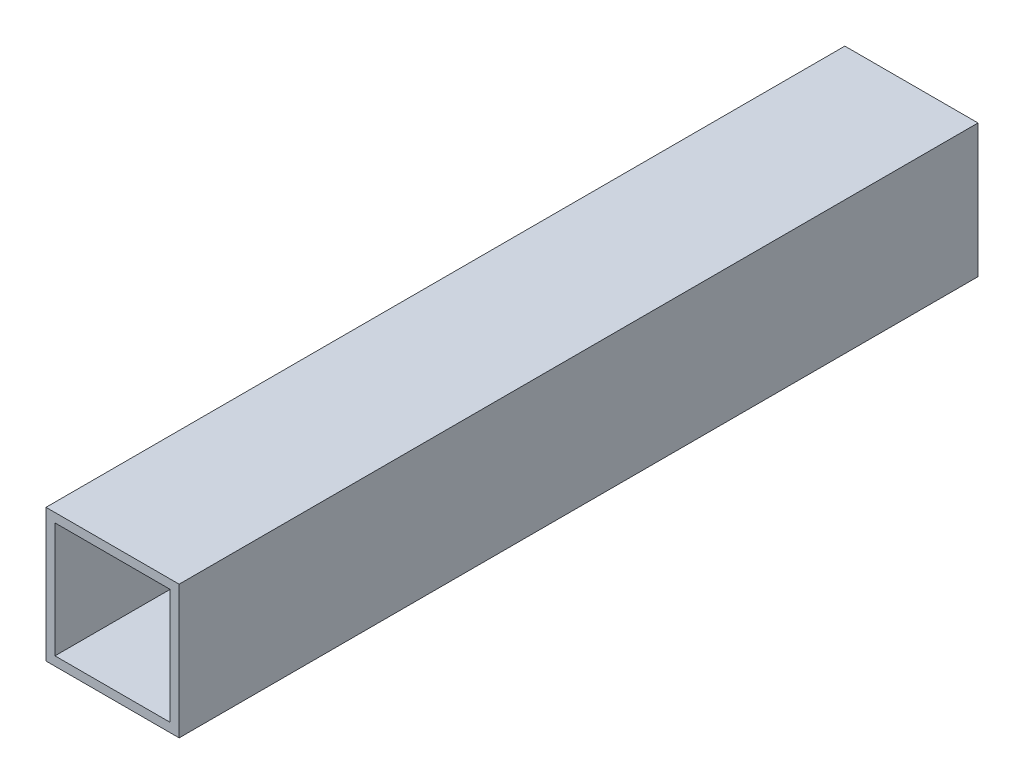
ISO-10303-21;
HEADER;
FILE_DESCRIPTION(('STEP AP214'),'2;1');
FILE_NAME('part.step','',(''),(''),'','','');
FILE_SCHEMA(('AUTOMOTIVE_DESIGN { 1 0 10303 214 1 1 1 1 }'));
ENDSEC;
DATA;
#1=APPLICATION_CONTEXT('core data for automotive mechanical design processes');
#2=APPLICATION_PROTOCOL_DEFINITION('international standard','automotive_design',2000,#1);
#3=PRODUCT_CONTEXT('',#1,'mechanical');
#4=PRODUCT('Part','Part','',(#3));
#5=PRODUCT_RELATED_PRODUCT_CATEGORY('part','',(#4));
#6=PRODUCT_DEFINITION_FORMATION('','',#4);
#7=PRODUCT_DEFINITION_CONTEXT('part definition',#1,'design');
#8=PRODUCT_DEFINITION('design','',#6,#7);
#9=PRODUCT_DEFINITION_SHAPE('','',#8);
#10=(LENGTH_UNIT() NAMED_UNIT(*) SI_UNIT(.MILLI.,.METRE.));
#11=(NAMED_UNIT(*) PLANE_ANGLE_UNIT() SI_UNIT($,.RADIAN.));
#12=(NAMED_UNIT(*) SI_UNIT($,.STERADIAN.) SOLID_ANGLE_UNIT());
#13=UNCERTAINTY_MEASURE_WITH_UNIT(LENGTH_MEASURE(1.E-05),#10,'distance_accuracy_value','');
#14=(GEOMETRIC_REPRESENTATION_CONTEXT(3) GLOBAL_UNCERTAINTY_ASSIGNED_CONTEXT((#13)) GLOBAL_UNIT_ASSIGNED_CONTEXT((#10,
#11,#12)) REPRESENTATION_CONTEXT('',''));
#15=CARTESIAN_POINT('',(0.,0.,0.));
#16=DIRECTION('',(0.,0.,1.));
#17=DIRECTION('',(1.,0.,0.));
#18=AXIS2_PLACEMENT_3D('',#15,#16,#17);
#19=CARTESIAN_POINT('',(0.,0.,76.2));
#20=DIRECTION('',(0.,0.,-1.));
#21=DIRECTION('',(-1.,0.,0.));
#22=AXIS2_PLACEMENT_3D('',#19,#20,#21);
#23=PLANE('',#22);
#24=DIRECTION('',(0.,1.,0.));
#25=VECTOR('',#24,1.);
#26=CARTESIAN_POINT('',(12.7,-12.7,76.2));
#27=LINE('',#26,#25);
#28=CARTESIAN_POINT('',(12.7,-12.7,76.2));
#29=VERTEX_POINT('',#28);
#30=CARTESIAN_POINT('',(12.7,12.7,76.2));
#31=VERTEX_POINT('',#30);
#32=EDGE_CURVE('E135',#29,#31,#27,.T.);
#33=ORIENTED_EDGE('',*,*,#32,.T.);
#34=DIRECTION('',(-1.,0.,0.));
#35=VECTOR('',#34,1.);
#36=CARTESIAN_POINT('',(-12.7,12.7,76.2));
#37=LINE('',#36,#35);
#38=CARTESIAN_POINT('',(-12.7,12.7,76.2));
#39=VERTEX_POINT('',#38);
#40=EDGE_CURVE('E138',#31,#39,#37,.T.);
#41=ORIENTED_EDGE('',*,*,#40,.T.);
#42=DIRECTION('',(0.,-1.,0.));
#43=VECTOR('',#42,1.);
#44=CARTESIAN_POINT('',(-12.7,-12.7,76.2));
#45=LINE('',#44,#43);
#46=CARTESIAN_POINT('',(-12.7,-12.7,76.2));
#47=VERTEX_POINT('',#46);
#48=EDGE_CURVE('E141',#39,#47,#45,.T.);
#49=ORIENTED_EDGE('',*,*,#48,.T.);
#50=DIRECTION('',(1.,0.,0.));
#51=VECTOR('',#50,1.);
#52=CARTESIAN_POINT('',(-12.7,-12.7,76.2));
#53=LINE('',#52,#51);
#54=EDGE_CURVE('E143',#47,#29,#53,.T.);
#55=ORIENTED_EDGE('',*,*,#54,.T.);
#56=EDGE_LOOP('',(#33,#41,#49,#55));
#57=FACE_BOUND('',#56,.T.);
#58=DIRECTION('',(0.,-1.,0.));
#59=VECTOR('',#58,1.);
#60=CARTESIAN_POINT('',(-10.9855,-10.9855,76.2));
#61=LINE('',#60,#59);
#62=CARTESIAN_POINT('',(-10.9855,10.9855,76.2));
#63=VERTEX_POINT('',#62);
#64=CARTESIAN_POINT('',(-10.9855,-10.9855,76.2));
#65=VERTEX_POINT('',#64);
#66=EDGE_CURVE('E99',#63,#65,#61,.T.);
#67=ORIENTED_EDGE('',*,*,#66,.F.);
#68=DIRECTION('',(-1.,0.,0.));
#69=VECTOR('',#68,1.);
#70=CARTESIAN_POINT('',(-10.9855,10.9855,76.2));
#71=LINE('',#70,#69);
#72=CARTESIAN_POINT('',(10.9855,10.9855,76.2));
#73=VERTEX_POINT('',#72);
#74=EDGE_CURVE('E121',#73,#63,#71,.T.);
#75=ORIENTED_EDGE('',*,*,#74,.F.);
#76=DIRECTION('',(0.,1.,0.));
#77=VECTOR('',#76,1.);
#78=CARTESIAN_POINT('',(10.9855,-10.9855,76.2));
#79=LINE('',#78,#77);
#80=CARTESIAN_POINT('',(10.9855,-10.9855,76.2));
#81=VERTEX_POINT('',#80);
#82=EDGE_CURVE('E119',#81,#73,#79,.T.);
#83=ORIENTED_EDGE('',*,*,#82,.F.);
#84=DIRECTION('',(1.,0.,0.));
#85=VECTOR('',#84,1.);
#86=CARTESIAN_POINT('',(-10.9855,-10.9855,76.2));
#87=LINE('',#86,#85);
#88=EDGE_CURVE('E107',#65,#81,#87,.T.);
#89=ORIENTED_EDGE('',*,*,#88,.F.);
#90=EDGE_LOOP('',(#67,#75,#83,#89));
#91=FACE_BOUND('',#90,.T.);
#92=ADVANCED_FACE('F34',(#57,#91),#23,.F.);
#93=CARTESIAN_POINT('',(0.,0.,-76.2));
#94=DIRECTION('',(0.,0.,-1.));
#95=DIRECTION('',(-1.,0.,0.));
#96=AXIS2_PLACEMENT_3D('',#93,#94,#95);
#97=PLANE('',#96);
#98=DIRECTION('',(0.,1.,0.));
#99=VECTOR('',#98,1.);
#100=CARTESIAN_POINT('',(12.7,-12.7,-76.2));
#101=LINE('',#100,#99);
#102=CARTESIAN_POINT('',(12.7,-12.7,-76.2));
#103=VERTEX_POINT('',#102);
#104=CARTESIAN_POINT('',(12.7,12.7,-76.2));
#105=VERTEX_POINT('',#104);
#106=EDGE_CURVE('E115',#103,#105,#101,.T.);
#107=ORIENTED_EDGE('',*,*,#106,.F.);
#108=DIRECTION('',(1.,0.,0.));
#109=VECTOR('',#108,1.);
#110=CARTESIAN_POINT('',(-12.7,-12.7,-76.2));
#111=LINE('',#110,#109);
#112=CARTESIAN_POINT('',(-12.7,-12.7,-76.2));
#113=VERTEX_POINT('',#112);
#114=EDGE_CURVE('E139',#113,#103,#111,.T.);
#115=ORIENTED_EDGE('',*,*,#114,.F.);
#116=DIRECTION('',(0.,-1.,0.));
#117=VECTOR('',#116,1.);
#118=CARTESIAN_POINT('',(-12.7,-12.7,-76.2));
#119=LINE('',#118,#117);
#120=CARTESIAN_POINT('',(-12.7,12.7,-76.2));
#121=VERTEX_POINT('',#120);
#122=EDGE_CURVE('E150',#121,#113,#119,.T.);
#123=ORIENTED_EDGE('',*,*,#122,.F.);
#124=DIRECTION('',(-1.,0.,0.));
#125=VECTOR('',#124,1.);
#126=CARTESIAN_POINT('',(-12.7,12.7,-76.2));
#127=LINE('',#126,#125);
#128=EDGE_CURVE('E148',#105,#121,#127,.T.);
#129=ORIENTED_EDGE('',*,*,#128,.F.);
#130=EDGE_LOOP('',(#107,#115,#123,#129));
#131=FACE_BOUND('',#130,.T.);
#132=DIRECTION('',(-1.,0.,0.));
#133=VECTOR('',#132,1.);
#134=CARTESIAN_POINT('',(-10.9855,10.9855,-76.2));
#135=LINE('',#134,#133);
#136=CARTESIAN_POINT('',(10.9855,10.9855,-76.2));
#137=VERTEX_POINT('',#136);
#138=CARTESIAN_POINT('',(-10.9855,10.9855,-76.2));
#139=VERTEX_POINT('',#138);
#140=EDGE_CURVE('E108',#137,#139,#135,.T.);
#141=ORIENTED_EDGE('',*,*,#140,.T.);
#142=DIRECTION('',(0.,-1.,0.));
#143=VECTOR('',#142,1.);
#144=CARTESIAN_POINT('',(-10.9855,-10.9855,-76.2));
#145=LINE('',#144,#143);
#146=CARTESIAN_POINT('',(-10.9855,-10.9855,-76.2));
#147=VERTEX_POINT('',#146);
#148=EDGE_CURVE('E57',#139,#147,#145,.T.);
#149=ORIENTED_EDGE('',*,*,#148,.T.);
#150=DIRECTION('',(1.,0.,0.));
#151=VECTOR('',#150,1.);
#152=CARTESIAN_POINT('',(-10.9855,-10.9855,-76.2));
#153=LINE('',#152,#151);
#154=CARTESIAN_POINT('',(10.9855,-10.9855,-76.2));
#155=VERTEX_POINT('',#154);
#156=EDGE_CURVE('E114',#147,#155,#153,.T.);
#157=ORIENTED_EDGE('',*,*,#156,.T.);
#158=DIRECTION('',(0.,1.,0.));
#159=VECTOR('',#158,1.);
#160=CARTESIAN_POINT('',(10.9855,-10.9855,-76.2));
#161=LINE('',#160,#159);
#162=EDGE_CURVE('E127',#155,#137,#161,.T.);
#163=ORIENTED_EDGE('',*,*,#162,.T.);
#164=EDGE_LOOP('',(#141,#149,#157,#163));
#165=FACE_BOUND('',#164,.T.);
#166=ADVANCED_FACE('F168',(#131,#165),#97,.T.);
#167=CARTESIAN_POINT('',(12.7,-12.7,76.2));
#168=DIRECTION('',(-1.,0.,0.));
#169=DIRECTION('',(0.,0.,1.));
#170=AXIS2_PLACEMENT_3D('',#167,#168,#169);
#171=PLANE('',#170);
#172=ORIENTED_EDGE('',*,*,#106,.T.);
#173=DIRECTION('',(0.,0.,-1.));
#174=VECTOR('',#173,1.);
#175=CARTESIAN_POINT('',(12.7,12.7,76.2));
#176=LINE('',#175,#174);
#177=EDGE_CURVE('E11',#31,#105,#176,.T.);
#178=ORIENTED_EDGE('',*,*,#177,.F.);
#179=ORIENTED_EDGE('',*,*,#32,.F.);
#180=DIRECTION('',(0.,0.,-1.));
#181=VECTOR('',#180,1.);
#182=CARTESIAN_POINT('',(12.7,-12.7,76.2));
#183=LINE('',#182,#181);
#184=EDGE_CURVE('E145',#29,#103,#183,.T.);
#185=ORIENTED_EDGE('',*,*,#184,.T.);
#186=EDGE_LOOP('',(#172,#178,#179,#185));
#187=FACE_BOUND('',#186,.T.);
#188=ADVANCED_FACE('F36',(#187),#171,.F.);
#189=CARTESIAN_POINT('',(-12.7,12.7,76.2));
#190=DIRECTION('',(0.,-1.,0.));
#191=DIRECTION('',(0.,0.,-1.));
#192=AXIS2_PLACEMENT_3D('',#189,#190,#191);
#193=PLANE('',#192);
#194=ORIENTED_EDGE('',*,*,#128,.T.);
#195=DIRECTION('',(0.,0.,-1.));
#196=VECTOR('',#195,1.);
#197=CARTESIAN_POINT('',(-12.7,12.7,76.2));
#198=LINE('',#197,#196);
#199=EDGE_CURVE('E42',#39,#121,#198,.T.);
#200=ORIENTED_EDGE('',*,*,#199,.F.);
#201=ORIENTED_EDGE('',*,*,#40,.F.);
#202=ORIENTED_EDGE('',*,*,#177,.T.);
#203=EDGE_LOOP('',(#194,#200,#201,#202));
#204=FACE_BOUND('',#203,.T.);
#205=ADVANCED_FACE('F178',(#204),#193,.F.);
#206=CARTESIAN_POINT('',(-12.7,-12.7,76.2));
#207=DIRECTION('',(1.,0.,0.));
#208=DIRECTION('',(0.,0.,-1.));
#209=AXIS2_PLACEMENT_3D('',#206,#207,#208);
#210=PLANE('',#209);
#211=ORIENTED_EDGE('',*,*,#122,.T.);
#212=DIRECTION('',(0.,0.,-1.));
#213=VECTOR('',#212,1.);
#214=CARTESIAN_POINT('',(-12.7,-12.7,76.2));
#215=LINE('',#214,#213);
#216=EDGE_CURVE('E155',#47,#113,#215,.T.);
#217=ORIENTED_EDGE('',*,*,#216,.F.);
#218=ORIENTED_EDGE('',*,*,#48,.F.);
#219=ORIENTED_EDGE('',*,*,#199,.T.);
#220=EDGE_LOOP('',(#211,#217,#218,#219));
#221=FACE_BOUND('',#220,.T.);
#222=ADVANCED_FACE('F162',(#221),#210,.F.);
#223=CARTESIAN_POINT('',(-12.7,-12.7,76.2));
#224=DIRECTION('',(0.,1.,0.));
#225=DIRECTION('',(0.,0.,1.));
#226=AXIS2_PLACEMENT_3D('',#223,#224,#225);
#227=PLANE('',#226);
#228=ORIENTED_EDGE('',*,*,#114,.T.);
#229=ORIENTED_EDGE('',*,*,#184,.F.);
#230=ORIENTED_EDGE('',*,*,#54,.F.);
#231=ORIENTED_EDGE('',*,*,#216,.T.);
#232=EDGE_LOOP('',(#228,#229,#230,#231));
#233=FACE_BOUND('',#232,.T.);
#234=ADVANCED_FACE('F172',(#233),#227,.F.);
#235=CARTESIAN_POINT('',(-10.9855,-10.9855,76.2));
#236=DIRECTION('',(1.,0.,0.));
#237=DIRECTION('',(0.,0.,-1.));
#238=AXIS2_PLACEMENT_3D('',#235,#236,#237);
#239=PLANE('',#238);
#240=ORIENTED_EDGE('',*,*,#148,.F.);
#241=DIRECTION('',(0.,0.,-1.));
#242=VECTOR('',#241,1.);
#243=CARTESIAN_POINT('',(-10.9855,10.9855,76.2));
#244=LINE('',#243,#242);
#245=EDGE_CURVE('E103',#63,#139,#244,.T.);
#246=ORIENTED_EDGE('',*,*,#245,.F.);
#247=ORIENTED_EDGE('',*,*,#66,.T.);
#248=DIRECTION('',(0.,0.,-1.));
#249=VECTOR('',#248,1.);
#250=CARTESIAN_POINT('',(-10.9855,-10.9855,76.2));
#251=LINE('',#250,#249);
#252=EDGE_CURVE('E102',#65,#147,#251,.T.);
#253=ORIENTED_EDGE('',*,*,#252,.T.);
#254=EDGE_LOOP('',(#240,#246,#247,#253));
#255=FACE_BOUND('',#254,.T.);
#256=ADVANCED_FACE('F101',(#255),#239,.T.);
#257=CARTESIAN_POINT('',(-10.9855,-10.9855,76.2));
#258=DIRECTION('',(0.,1.,0.));
#259=DIRECTION('',(0.,0.,1.));
#260=AXIS2_PLACEMENT_3D('',#257,#258,#259);
#261=PLANE('',#260);
#262=ORIENTED_EDGE('',*,*,#156,.F.);
#263=ORIENTED_EDGE('',*,*,#252,.F.);
#264=ORIENTED_EDGE('',*,*,#88,.T.);
#265=DIRECTION('',(0.,0.,-1.));
#266=VECTOR('',#265,1.);
#267=CARTESIAN_POINT('',(10.9855,-10.9855,76.2));
#268=LINE('',#267,#266);
#269=EDGE_CURVE('E116',#81,#155,#268,.T.);
#270=ORIENTED_EDGE('',*,*,#269,.T.);
#271=EDGE_LOOP('',(#262,#263,#264,#270));
#272=FACE_BOUND('',#271,.T.);
#273=ADVANCED_FACE('F111',(#272),#261,.T.);
#274=CARTESIAN_POINT('',(10.9855,-10.9855,76.2));
#275=DIRECTION('',(-1.,0.,0.));
#276=DIRECTION('',(0.,0.,1.));
#277=AXIS2_PLACEMENT_3D('',#274,#275,#276);
#278=PLANE('',#277);
#279=ORIENTED_EDGE('',*,*,#162,.F.);
#280=ORIENTED_EDGE('',*,*,#269,.F.);
#281=ORIENTED_EDGE('',*,*,#82,.T.);
#282=DIRECTION('',(0.,0.,-1.));
#283=VECTOR('',#282,1.);
#284=CARTESIAN_POINT('',(10.9855,10.9855,76.2));
#285=LINE('',#284,#283);
#286=EDGE_CURVE('E49',#73,#137,#285,.T.);
#287=ORIENTED_EDGE('',*,*,#286,.T.);
#288=EDGE_LOOP('',(#279,#280,#281,#287));
#289=FACE_BOUND('',#288,.T.);
#290=ADVANCED_FACE('F201',(#289),#278,.T.);
#291=CARTESIAN_POINT('',(-10.9855,10.9855,76.2));
#292=DIRECTION('',(0.,-1.,0.));
#293=DIRECTION('',(0.,0.,-1.));
#294=AXIS2_PLACEMENT_3D('',#291,#292,#293);
#295=PLANE('',#294);
#296=ORIENTED_EDGE('',*,*,#140,.F.);
#297=ORIENTED_EDGE('',*,*,#286,.F.);
#298=ORIENTED_EDGE('',*,*,#74,.T.);
#299=ORIENTED_EDGE('',*,*,#245,.T.);
#300=EDGE_LOOP('',(#296,#297,#298,#299));
#301=FACE_BOUND('',#300,.T.);
#302=ADVANCED_FACE('F205',(#301),#295,.T.);
#303=CLOSED_SHELL('',(#92,#166,#188,#205,#222,#234,#256,#273,#290,#302));
#304=MANIFOLD_SOLID_BREP('B2',#303);
#305=ADVANCED_BREP_SHAPE_REPRESENTATION('',(#18,#304),#14);
#306=SHAPE_DEFINITION_REPRESENTATION(#9,#305);
ENDSEC;
END-ISO-10303-21;
